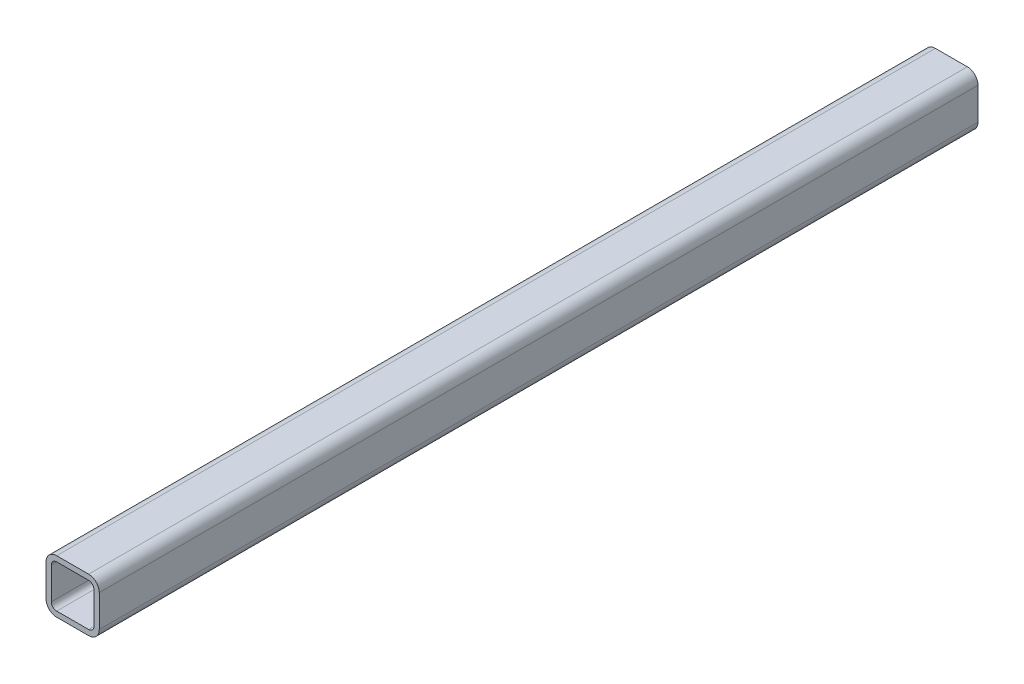
ISO-10303-21;
HEADER;
FILE_DESCRIPTION(('STEP AP214'),'2;1');
FILE_NAME('part.step','',(''),(''),'','','');
FILE_SCHEMA(('AUTOMOTIVE_DESIGN { 1 0 10303 214 1 1 1 1 }'));
ENDSEC;
DATA;
#1=APPLICATION_CONTEXT('core data for automotive mechanical design processes');
#2=APPLICATION_PROTOCOL_DEFINITION('international standard','automotive_design',2000,#1);
#3=PRODUCT_CONTEXT('',#1,'mechanical');
#4=PRODUCT('Part','Part','',(#3));
#5=PRODUCT_RELATED_PRODUCT_CATEGORY('part','',(#4));
#6=PRODUCT_DEFINITION_FORMATION('','',#4);
#7=PRODUCT_DEFINITION_CONTEXT('part definition',#1,'design');
#8=PRODUCT_DEFINITION('design','',#6,#7);
#9=PRODUCT_DEFINITION_SHAPE('','',#8);
#10=(LENGTH_UNIT() NAMED_UNIT(*) SI_UNIT(.MILLI.,.METRE.));
#11=(NAMED_UNIT(*) PLANE_ANGLE_UNIT() SI_UNIT($,.RADIAN.));
#12=(NAMED_UNIT(*) SI_UNIT($,.STERADIAN.) SOLID_ANGLE_UNIT());
#13=UNCERTAINTY_MEASURE_WITH_UNIT(LENGTH_MEASURE(1.E-05),#10,'distance_accuracy_value','');
#14=(GEOMETRIC_REPRESENTATION_CONTEXT(3) GLOBAL_UNCERTAINTY_ASSIGNED_CONTEXT((#13)) GLOBAL_UNIT_ASSIGNED_CONTEXT((#10,
#11,#12)) REPRESENTATION_CONTEXT('',''));
#15=CARTESIAN_POINT('',(0.,0.,0.));
#16=DIRECTION('',(0.,0.,1.));
#17=DIRECTION('',(1.,0.,0.));
#18=AXIS2_PLACEMENT_3D('',#15,#16,#17);
#19=CARTESIAN_POINT('',(-140.,-6.00000000000001,1300.));
#20=DIRECTION('',(-1.,0.,0.));
#21=DIRECTION('',(0.,0.,1.));
#22=AXIS2_PLACEMENT_3D('',#19,#20,#21);
#23=PLANE('',#22);
#24=DIRECTION('',(0.,-1.,0.));
#25=VECTOR('',#24,1.);
#26=CARTESIAN_POINT('',(-140.,-6.00000000000001,1310.));
#27=LINE('',#26,#25);
#28=CARTESIAN_POINT('',(-140.,6.00000000000001,1310.));
#29=VERTEX_POINT('',#28);
#30=CARTESIAN_POINT('',(-140.,-6.00000000000001,1310.));
#31=VERTEX_POINT('',#30);
#32=EDGE_CURVE('E11',#29,#31,#27,.T.);
#33=ORIENTED_EDGE('',*,*,#32,.F.);
#34=DIRECTION('',(0.,0.,1.));
#35=VECTOR('',#34,1.);
#36=CARTESIAN_POINT('',(-140.,6.00000000000001,1300.));
#37=LINE('',#36,#35);
#38=CARTESIAN_POINT('',(-140.,6.00000000000001,1640.));
#39=VERTEX_POINT('',#38);
#40=EDGE_CURVE('E178',#29,#39,#37,.T.);
#41=ORIENTED_EDGE('',*,*,#40,.T.);
#42=DIRECTION('',(0.,1.,0.));
#43=VECTOR('',#42,1.);
#44=CARTESIAN_POINT('',(-140.,-6.00000000000001,1640.));
#45=LINE('',#44,#43);
#46=CARTESIAN_POINT('',(-140.,-6.00000000000001,1640.));
#47=VERTEX_POINT('',#46);
#48=EDGE_CURVE('E49',#47,#39,#45,.T.);
#49=ORIENTED_EDGE('',*,*,#48,.F.);
#50=DIRECTION('',(0.,0.,1.));
#51=VECTOR('',#50,1.);
#52=CARTESIAN_POINT('',(-140.,-6.00000000000001,1300.));
#53=LINE('',#52,#51);
#54=EDGE_CURVE('E182',#31,#47,#53,.T.);
#55=ORIENTED_EDGE('',*,*,#54,.F.);
#56=EDGE_LOOP('',(#33,#41,#49,#55));
#57=FACE_BOUND('',#56,.T.);
#58=ADVANCED_FACE('F41',(#57),#23,.F.);
#59=CARTESIAN_POINT('',(-144.,6.00000000000001,1300.));
#60=DIRECTION('',(0.,0.,1.));
#61=DIRECTION('',(1.,0.,0.));
#62=AXIS2_PLACEMENT_3D('',#59,#60,#61);
#63=CYLINDRICAL_SURFACE('',#62,4.);
#64=CARTESIAN_POINT('',(-144.,6.00000000000001,1310.));
#65=DIRECTION('',(0.,0.,-1.));
#66=DIRECTION('',(-1.,0.,0.));
#67=AXIS2_PLACEMENT_3D('',#64,#65,#66);
#68=CIRCLE('',#67,4.);
#69=CARTESIAN_POINT('',(-144.,10.,1310.));
#70=VERTEX_POINT('',#69);
#71=EDGE_CURVE('E177',#70,#29,#68,.T.);
#72=ORIENTED_EDGE('',*,*,#71,.F.);
#73=DIRECTION('',(0.,0.,1.));
#74=VECTOR('',#73,1.);
#75=CARTESIAN_POINT('',(-144.,10.,1300.));
#76=LINE('',#75,#74);
#77=CARTESIAN_POINT('',(-144.,10.,1640.));
#78=VERTEX_POINT('',#77);
#79=EDGE_CURVE('E170',#70,#78,#76,.T.);
#80=ORIENTED_EDGE('',*,*,#79,.T.);
#81=CARTESIAN_POINT('',(-144.,6.00000000000001,1640.));
#82=DIRECTION('',(0.,0.,1.));
#83=DIRECTION('',(1.,0.,0.));
#84=AXIS2_PLACEMENT_3D('',#81,#82,#83);
#85=CIRCLE('',#84,4.);
#86=EDGE_CURVE('E152',#39,#78,#85,.T.);
#87=ORIENTED_EDGE('',*,*,#86,.F.);
#88=ORIENTED_EDGE('',*,*,#40,.F.);
#89=EDGE_LOOP('',(#72,#80,#87,#88));
#90=FACE_BOUND('',#89,.T.);
#91=ADVANCED_FACE('F176',(#90),#63,.T.);
#92=CARTESIAN_POINT('',(-156.,10.,1300.));
#93=DIRECTION('',(0.,-1.,0.));
#94=DIRECTION('',(0.,0.,-1.));
#95=AXIS2_PLACEMENT_3D('',#92,#93,#94);
#96=PLANE('',#95);
#97=DIRECTION('',(1.,0.,0.));
#98=VECTOR('',#97,1.);
#99=CARTESIAN_POINT('',(-150.,10.,1310.));
#100=LINE('',#99,#98);
#101=CARTESIAN_POINT('',(-156.,10.,1310.));
#102=VERTEX_POINT('',#101);
#103=EDGE_CURVE('E287',#102,#70,#100,.T.);
#104=ORIENTED_EDGE('',*,*,#103,.F.);
#105=DIRECTION('',(0.,0.,1.));
#106=VECTOR('',#105,1.);
#107=CARTESIAN_POINT('',(-156.,10.,1300.));
#108=LINE('',#107,#106);
#109=CARTESIAN_POINT('',(-156.,10.,1640.));
#110=VERTEX_POINT('',#109);
#111=EDGE_CURVE('E172',#102,#110,#108,.T.);
#112=ORIENTED_EDGE('',*,*,#111,.T.);
#113=DIRECTION('',(-1.,0.,0.));
#114=VECTOR('',#113,1.);
#115=CARTESIAN_POINT('',(150.,10.,1640.));
#116=LINE('',#115,#114);
#117=EDGE_CURVE('E155',#78,#110,#116,.T.);
#118=ORIENTED_EDGE('',*,*,#117,.F.);
#119=ORIENTED_EDGE('',*,*,#79,.F.);
#120=EDGE_LOOP('',(#104,#112,#118,#119));
#121=FACE_BOUND('',#120,.T.);
#122=ADVANCED_FACE('F169',(#121),#96,.F.);
#123=CARTESIAN_POINT('',(-156.,6.00000000000001,1300.));
#124=DIRECTION('',(0.,0.,1.));
#125=DIRECTION('',(1.,0.,0.));
#126=AXIS2_PLACEMENT_3D('',#123,#124,#125);
#127=CYLINDRICAL_SURFACE('',#126,4.);
#128=CARTESIAN_POINT('',(-156.,6.00000000000001,1310.));
#129=DIRECTION('',(0.,0.,-1.));
#130=DIRECTION('',(-1.,0.,0.));
#131=AXIS2_PLACEMENT_3D('',#128,#129,#130);
#132=CIRCLE('',#131,4.);
#133=CARTESIAN_POINT('',(-160.,6.00000000000001,1310.));
#134=VERTEX_POINT('',#133);
#135=EDGE_CURVE('E234',#134,#102,#132,.T.);
#136=ORIENTED_EDGE('',*,*,#135,.F.);
#137=DIRECTION('',(0.,0.,1.));
#138=VECTOR('',#137,1.);
#139=CARTESIAN_POINT('',(-160.,6.00000000000001,1300.));
#140=LINE('',#139,#138);
#141=CARTESIAN_POINT('',(-160.,6.00000000000001,1640.));
#142=VERTEX_POINT('',#141);
#143=EDGE_CURVE('E180',#134,#142,#140,.T.);
#144=ORIENTED_EDGE('',*,*,#143,.T.);
#145=CARTESIAN_POINT('',(-156.,6.00000000000001,1640.));
#146=DIRECTION('',(0.,0.,1.));
#147=DIRECTION('',(1.,0.,0.));
#148=AXIS2_PLACEMENT_3D('',#145,#146,#147);
#149=CIRCLE('',#148,4.);
#150=EDGE_CURVE('E263',#110,#142,#149,.T.);
#151=ORIENTED_EDGE('',*,*,#150,.F.);
#152=ORIENTED_EDGE('',*,*,#111,.F.);
#153=EDGE_LOOP('',(#136,#144,#151,#152));
#154=FACE_BOUND('',#153,.T.);
#155=ADVANCED_FACE('F296',(#154),#127,.T.);
#156=CARTESIAN_POINT('',(-160.,6.00000000000001,1300.));
#157=DIRECTION('',(1.,0.,0.));
#158=DIRECTION('',(0.,0.,-1.));
#159=AXIS2_PLACEMENT_3D('',#156,#157,#158);
#160=PLANE('',#159);
#161=DIRECTION('',(0.,1.,0.));
#162=VECTOR('',#161,1.);
#163=CARTESIAN_POINT('',(-160.,6.00000000000001,1310.));
#164=LINE('',#163,#162);
#165=CARTESIAN_POINT('',(-160.,-6.00000000000001,1310.));
#166=VERTEX_POINT('',#165);
#167=EDGE_CURVE('E232',#166,#134,#164,.T.);
#168=ORIENTED_EDGE('',*,*,#167,.F.);
#169=DIRECTION('',(0.,0.,1.));
#170=VECTOR('',#169,1.);
#171=CARTESIAN_POINT('',(-160.,-6.00000000000001,1300.));
#172=LINE('',#171,#170);
#173=CARTESIAN_POINT('',(-160.,-6.00000000000001,1640.));
#174=VERTEX_POINT('',#173);
#175=EDGE_CURVE('E188',#166,#174,#172,.T.);
#176=ORIENTED_EDGE('',*,*,#175,.T.);
#177=DIRECTION('',(0.,-1.,0.));
#178=VECTOR('',#177,1.);
#179=CARTESIAN_POINT('',(-160.,6.00000000000001,1640.));
#180=LINE('',#179,#178);
#181=EDGE_CURVE('E261',#142,#174,#180,.T.);
#182=ORIENTED_EDGE('',*,*,#181,.F.);
#183=ORIENTED_EDGE('',*,*,#143,.F.);
#184=EDGE_LOOP('',(#168,#176,#182,#183));
#185=FACE_BOUND('',#184,.T.);
#186=ADVANCED_FACE('F302',(#185),#160,.F.);
#187=CARTESIAN_POINT('',(-156.,-6.00000000000001,1300.));
#188=DIRECTION('',(0.,0.,1.));
#189=DIRECTION('',(1.,0.,0.));
#190=AXIS2_PLACEMENT_3D('',#187,#188,#189);
#191=CYLINDRICAL_SURFACE('',#190,4.);
#192=CARTESIAN_POINT('',(-156.,-6.00000000000001,1310.));
#193=DIRECTION('',(0.,0.,-1.));
#194=DIRECTION('',(-1.,0.,0.));
#195=AXIS2_PLACEMENT_3D('',#192,#193,#194);
#196=CIRCLE('',#195,4.);
#197=CARTESIAN_POINT('',(-156.,-10.,1310.));
#198=VERTEX_POINT('',#197);
#199=EDGE_CURVE('E201',#198,#166,#196,.T.);
#200=ORIENTED_EDGE('',*,*,#199,.F.);
#201=DIRECTION('',(0.,0.,1.));
#202=VECTOR('',#201,1.);
#203=CARTESIAN_POINT('',(-156.,-10.,1300.));
#204=LINE('',#203,#202);
#205=CARTESIAN_POINT('',(-156.,-10.,1640.));
#206=VERTEX_POINT('',#205);
#207=EDGE_CURVE('E191',#198,#206,#204,.T.);
#208=ORIENTED_EDGE('',*,*,#207,.T.);
#209=CARTESIAN_POINT('',(-156.,-6.00000000000001,1640.));
#210=DIRECTION('',(0.,0.,1.));
#211=DIRECTION('',(1.,0.,0.));
#212=AXIS2_PLACEMENT_3D('',#209,#210,#211);
#213=CIRCLE('',#212,4.);
#214=EDGE_CURVE('E259',#174,#206,#213,.T.);
#215=ORIENTED_EDGE('',*,*,#214,.F.);
#216=ORIENTED_EDGE('',*,*,#175,.F.);
#217=EDGE_LOOP('',(#200,#208,#215,#216));
#218=FACE_BOUND('',#217,.T.);
#219=ADVANCED_FACE('F306',(#218),#191,.T.);
#220=CARTESIAN_POINT('',(-144.,-10.,1300.));
#221=DIRECTION('',(0.,1.,0.));
#222=DIRECTION('',(0.,0.,1.));
#223=AXIS2_PLACEMENT_3D('',#220,#221,#222);
#224=PLANE('',#223);
#225=DIRECTION('',(1.,0.,0.));
#226=VECTOR('',#225,1.);
#227=CARTESIAN_POINT('',(-150.,-10.,1310.));
#228=LINE('',#227,#226);
#229=CARTESIAN_POINT('',(-144.,-10.,1310.));
#230=VERTEX_POINT('',#229);
#231=EDGE_CURVE('E163',#198,#230,#228,.T.);
#232=ORIENTED_EDGE('',*,*,#231,.T.);
#233=DIRECTION('',(0.,0.,1.));
#234=VECTOR('',#233,1.);
#235=CARTESIAN_POINT('',(-144.,-10.,1300.));
#236=LINE('',#235,#234);
#237=CARTESIAN_POINT('',(-144.,-10.,1640.));
#238=VERTEX_POINT('',#237);
#239=EDGE_CURVE('E194',#230,#238,#236,.T.);
#240=ORIENTED_EDGE('',*,*,#239,.T.);
#241=DIRECTION('',(-1.,0.,0.));
#242=VECTOR('',#241,1.);
#243=CARTESIAN_POINT('',(150.,-10.,1640.));
#244=LINE('',#243,#242);
#245=EDGE_CURVE('E173',#238,#206,#244,.T.);
#246=ORIENTED_EDGE('',*,*,#245,.T.);
#247=ORIENTED_EDGE('',*,*,#207,.F.);
#248=EDGE_LOOP('',(#232,#240,#246,#247));
#249=FACE_BOUND('',#248,.T.);
#250=ADVANCED_FACE('F309',(#249),#224,.F.);
#251=CARTESIAN_POINT('',(-144.,-6.00000000000001,1300.));
#252=DIRECTION('',(0.,0.,1.));
#253=DIRECTION('',(1.,0.,0.));
#254=AXIS2_PLACEMENT_3D('',#251,#252,#253);
#255=CYLINDRICAL_SURFACE('',#254,4.);
#256=CARTESIAN_POINT('',(-144.,-6.00000000000001,1310.));
#257=DIRECTION('',(0.,0.,-1.));
#258=DIRECTION('',(-1.,0.,0.));
#259=AXIS2_PLACEMENT_3D('',#256,#257,#258);
#260=CIRCLE('',#259,4.);
#261=EDGE_CURVE('E256',#31,#230,#260,.T.);
#262=ORIENTED_EDGE('',*,*,#261,.F.);
#263=ORIENTED_EDGE('',*,*,#54,.T.);
#264=CARTESIAN_POINT('',(-144.,-6.00000000000001,1640.));
#265=DIRECTION('',(0.,0.,1.));
#266=DIRECTION('',(1.,0.,0.));
#267=AXIS2_PLACEMENT_3D('',#264,#265,#266);
#268=CIRCLE('',#267,4.);
#269=EDGE_CURVE('E162',#238,#47,#268,.T.);
#270=ORIENTED_EDGE('',*,*,#269,.F.);
#271=ORIENTED_EDGE('',*,*,#239,.F.);
#272=EDGE_LOOP('',(#262,#263,#270,#271));
#273=FACE_BOUND('',#272,.T.);
#274=ADVANCED_FACE('F311',(#273),#255,.T.);
#275=CARTESIAN_POINT('',(150.,6.,1640.));
#276=DIRECTION('',(0.,0.,1.));
#277=DIRECTION('',(1.,0.,0.));
#278=AXIS2_PLACEMENT_3D('',#275,#276,#277);
#279=PLANE('',#278);
#280=DIRECTION('',(0.,-1.,0.));
#281=VECTOR('',#280,1.);
#282=CARTESIAN_POINT('',(-158.,6.00000000000001,1640.));
#283=LINE('',#282,#281);
#284=CARTESIAN_POINT('',(-158.,6.00000000000001,1640.));
#285=VERTEX_POINT('',#284);
#286=CARTESIAN_POINT('',(-158.,-6.00000000000001,1640.));
#287=VERTEX_POINT('',#286);
#288=EDGE_CURVE('E283',#285,#287,#283,.T.);
#289=ORIENTED_EDGE('',*,*,#288,.F.);
#290=CARTESIAN_POINT('',(-156.,6.00000000000001,1640.));
#291=DIRECTION('',(0.,0.,1.));
#292=DIRECTION('',(1.,0.,0.));
#293=AXIS2_PLACEMENT_3D('',#290,#291,#292);
#294=CIRCLE('',#293,2.);
#295=CARTESIAN_POINT('',(-156.,8.00000000000001,1640.));
#296=VERTEX_POINT('',#295);
#297=EDGE_CURVE('E280',#296,#285,#294,.T.);
#298=ORIENTED_EDGE('',*,*,#297,.F.);
#299=DIRECTION('',(-1.,0.,0.));
#300=VECTOR('',#299,1.);
#301=CARTESIAN_POINT('',(-156.,8.00000000000001,1640.));
#302=LINE('',#301,#300);
#303=CARTESIAN_POINT('',(-144.,8.00000000000001,1640.));
#304=VERTEX_POINT('',#303);
#305=EDGE_CURVE('E277',#304,#296,#302,.T.);
#306=ORIENTED_EDGE('',*,*,#305,.F.);
#307=CARTESIAN_POINT('',(-144.,6.00000000000001,1640.));
#308=DIRECTION('',(0.,0.,1.));
#309=DIRECTION('',(1.,0.,0.));
#310=AXIS2_PLACEMENT_3D('',#307,#308,#309);
#311=CIRCLE('',#310,2.);
#312=CARTESIAN_POINT('',(-142.,6.00000000000001,1640.));
#313=VERTEX_POINT('',#312);
#314=EDGE_CURVE('E274',#313,#304,#311,.T.);
#315=ORIENTED_EDGE('',*,*,#314,.F.);
#316=DIRECTION('',(0.,1.,0.));
#317=VECTOR('',#316,1.);
#318=CARTESIAN_POINT('',(-142.,-6.00000000000001,1640.));
#319=LINE('',#318,#317);
#320=CARTESIAN_POINT('',(-142.,-6.00000000000001,1640.));
#321=VERTEX_POINT('',#320);
#322=EDGE_CURVE('E271',#321,#313,#319,.T.);
#323=ORIENTED_EDGE('',*,*,#322,.F.);
#324=CARTESIAN_POINT('',(-144.,-6.00000000000001,1640.));
#325=DIRECTION('',(0.,0.,1.));
#326=DIRECTION('',(1.,0.,0.));
#327=AXIS2_PLACEMENT_3D('',#324,#325,#326);
#328=CIRCLE('',#327,2.);
#329=CARTESIAN_POINT('',(-144.,-8.00000000000001,1640.));
#330=VERTEX_POINT('',#329);
#331=EDGE_CURVE('E268',#330,#321,#328,.T.);
#332=ORIENTED_EDGE('',*,*,#331,.F.);
#333=DIRECTION('',(1.,0.,0.));
#334=VECTOR('',#333,1.);
#335=CARTESIAN_POINT('',(-144.,-8.00000000000001,1640.));
#336=LINE('',#335,#334);
#337=CARTESIAN_POINT('',(-156.,-8.00000000000001,1640.));
#338=VERTEX_POINT('',#337);
#339=EDGE_CURVE('E266',#338,#330,#336,.T.);
#340=ORIENTED_EDGE('',*,*,#339,.F.);
#341=CARTESIAN_POINT('',(-156.,-6.00000000000001,1640.));
#342=DIRECTION('',(0.,0.,1.));
#343=DIRECTION('',(1.,0.,0.));
#344=AXIS2_PLACEMENT_3D('',#341,#342,#343);
#345=CIRCLE('',#344,2.);
#346=EDGE_CURVE('E64',#287,#338,#345,.T.);
#347=ORIENTED_EDGE('',*,*,#346,.F.);
#348=EDGE_LOOP('',(#289,#298,#306,#315,#323,#332,#340,#347));
#349=FACE_BOUND('',#348,.T.);
#350=ORIENTED_EDGE('',*,*,#214,.T.);
#351=ORIENTED_EDGE('',*,*,#245,.F.);
#352=ORIENTED_EDGE('',*,*,#269,.T.);
#353=ORIENTED_EDGE('',*,*,#48,.T.);
#354=ORIENTED_EDGE('',*,*,#86,.T.);
#355=ORIENTED_EDGE('',*,*,#117,.T.);
#356=ORIENTED_EDGE('',*,*,#150,.T.);
#357=ORIENTED_EDGE('',*,*,#181,.T.);
#358=EDGE_LOOP('',(#350,#351,#352,#353,#354,#355,#356,#357));
#359=FACE_BOUND('',#358,.T.);
#360=ADVANCED_FACE('F154',(#349,#359),#279,.T.);
#361=CARTESIAN_POINT('',(-150.,6.,1310.));
#362=DIRECTION('',(0.,0.,-1.));
#363=DIRECTION('',(-1.,0.,0.));
#364=AXIS2_PLACEMENT_3D('',#361,#362,#363);
#365=PLANE('',#364);
#366=DIRECTION('',(-1.,0.,0.));
#367=VECTOR('',#366,1.);
#368=CARTESIAN_POINT('',(-144.,-8.00000000000001,1310.));
#369=LINE('',#368,#367);
#370=CARTESIAN_POINT('',(-144.,-8.00000000000001,1310.));
#371=VERTEX_POINT('',#370);
#372=CARTESIAN_POINT('',(-156.,-8.00000000000001,1310.));
#373=VERTEX_POINT('',#372);
#374=EDGE_CURVE('E239',#371,#373,#369,.T.);
#375=ORIENTED_EDGE('',*,*,#374,.F.);
#376=CARTESIAN_POINT('',(-144.,-6.00000000000001,1310.));
#377=DIRECTION('',(0.,0.,-1.));
#378=DIRECTION('',(-1.,0.,0.));
#379=AXIS2_PLACEMENT_3D('',#376,#377,#378);
#380=CIRCLE('',#379,2.);
#381=CARTESIAN_POINT('',(-142.,-6.00000000000001,1310.));
#382=VERTEX_POINT('',#381);
#383=EDGE_CURVE('E241',#382,#371,#380,.T.);
#384=ORIENTED_EDGE('',*,*,#383,.F.);
#385=DIRECTION('',(0.,-1.,0.));
#386=VECTOR('',#385,1.);
#387=CARTESIAN_POINT('',(-142.,-6.00000000000001,1310.));
#388=LINE('',#387,#386);
#389=CARTESIAN_POINT('',(-142.,6.00000000000001,1310.));
#390=VERTEX_POINT('',#389);
#391=EDGE_CURVE('E244',#390,#382,#388,.T.);
#392=ORIENTED_EDGE('',*,*,#391,.F.);
#393=CARTESIAN_POINT('',(-144.,6.00000000000001,1310.));
#394=DIRECTION('',(0.,0.,-1.));
#395=DIRECTION('',(-1.,0.,0.));
#396=AXIS2_PLACEMENT_3D('',#393,#394,#395);
#397=CIRCLE('',#396,2.);
#398=CARTESIAN_POINT('',(-144.,8.00000000000001,1310.));
#399=VERTEX_POINT('',#398);
#400=EDGE_CURVE('E247',#399,#390,#397,.T.);
#401=ORIENTED_EDGE('',*,*,#400,.F.);
#402=DIRECTION('',(1.,0.,0.));
#403=VECTOR('',#402,1.);
#404=CARTESIAN_POINT('',(-156.,8.00000000000001,1310.));
#405=LINE('',#404,#403);
#406=CARTESIAN_POINT('',(-156.,8.00000000000001,1310.));
#407=VERTEX_POINT('',#406);
#408=EDGE_CURVE('E250',#407,#399,#405,.T.);
#409=ORIENTED_EDGE('',*,*,#408,.F.);
#410=CARTESIAN_POINT('',(-156.,6.00000000000001,1310.));
#411=DIRECTION('',(0.,0.,-1.));
#412=DIRECTION('',(-1.,0.,0.));
#413=AXIS2_PLACEMENT_3D('',#410,#411,#412);
#414=CIRCLE('',#413,2.);
#415=CARTESIAN_POINT('',(-158.,6.00000000000001,1310.));
#416=VERTEX_POINT('',#415);
#417=EDGE_CURVE('E56',#416,#407,#414,.T.);
#418=ORIENTED_EDGE('',*,*,#417,.F.);
#419=DIRECTION('',(0.,1.,0.));
#420=VECTOR('',#419,1.);
#421=CARTESIAN_POINT('',(-158.,6.00000000000001,1310.));
#422=LINE('',#421,#420);
#423=CARTESIAN_POINT('',(-158.,-6.00000000000001,1310.));
#424=VERTEX_POINT('',#423);
#425=EDGE_CURVE('E254',#424,#416,#422,.T.);
#426=ORIENTED_EDGE('',*,*,#425,.F.);
#427=CARTESIAN_POINT('',(-156.,-6.00000000000001,1310.));
#428=DIRECTION('',(0.,0.,-1.));
#429=DIRECTION('',(-1.,0.,0.));
#430=AXIS2_PLACEMENT_3D('',#427,#428,#429);
#431=CIRCLE('',#430,2.);
#432=EDGE_CURVE('E236',#373,#424,#431,.T.);
#433=ORIENTED_EDGE('',*,*,#432,.F.);
#434=EDGE_LOOP('',(#375,#384,#392,#401,#409,#418,#426,#433));
#435=FACE_BOUND('',#434,.T.);
#436=ORIENTED_EDGE('',*,*,#199,.T.);
#437=ORIENTED_EDGE('',*,*,#167,.T.);
#438=ORIENTED_EDGE('',*,*,#135,.T.);
#439=ORIENTED_EDGE('',*,*,#103,.T.);
#440=ORIENTED_EDGE('',*,*,#71,.T.);
#441=ORIENTED_EDGE('',*,*,#32,.T.);
#442=ORIENTED_EDGE('',*,*,#261,.T.);
#443=ORIENTED_EDGE('',*,*,#231,.F.);
#444=EDGE_LOOP('',(#436,#437,#438,#439,#440,#441,#442,#443));
#445=FACE_BOUND('',#444,.T.);
#446=ADVANCED_FACE('F292',(#435,#445),#365,.T.);
#447=CARTESIAN_POINT('',(-156.,-6.00000000000001,1300.));
#448=DIRECTION('',(0.,0.,1.));
#449=DIRECTION('',(1.,0.,0.));
#450=AXIS2_PLACEMENT_3D('',#447,#448,#449);
#451=CYLINDRICAL_SURFACE('',#450,2.);
#452=DIRECTION('',(0.,0.,1.));
#453=VECTOR('',#452,1.);
#454=CARTESIAN_POINT('',(-156.,-8.00000000000001,1300.));
#455=LINE('',#454,#453);
#456=EDGE_CURVE('E219',#373,#338,#455,.T.);
#457=ORIENTED_EDGE('',*,*,#456,.F.);
#458=ORIENTED_EDGE('',*,*,#432,.T.);
#459=DIRECTION('',(0.,0.,1.));
#460=VECTOR('',#459,1.);
#461=CARTESIAN_POINT('',(-158.,-6.00000000000001,1300.));
#462=LINE('',#461,#460);
#463=EDGE_CURVE('E197',#424,#287,#462,.T.);
#464=ORIENTED_EDGE('',*,*,#463,.T.);
#465=ORIENTED_EDGE('',*,*,#346,.T.);
#466=EDGE_LOOP('',(#457,#458,#464,#465));
#467=FACE_BOUND('',#466,.T.);
#468=ADVANCED_FACE('F43',(#467),#451,.F.);
#469=CARTESIAN_POINT('',(-144.,-8.00000000000001,1300.));
#470=DIRECTION('',(0.,1.,0.));
#471=DIRECTION('',(0.,0.,1.));
#472=AXIS2_PLACEMENT_3D('',#469,#470,#471);
#473=PLANE('',#472);
#474=DIRECTION('',(0.,0.,1.));
#475=VECTOR('',#474,1.);
#476=CARTESIAN_POINT('',(-144.,-8.00000000000001,1300.));
#477=LINE('',#476,#475);
#478=EDGE_CURVE('E216',#371,#330,#477,.T.);
#479=ORIENTED_EDGE('',*,*,#478,.F.);
#480=ORIENTED_EDGE('',*,*,#374,.T.);
#481=ORIENTED_EDGE('',*,*,#456,.T.);
#482=ORIENTED_EDGE('',*,*,#339,.T.);
#483=EDGE_LOOP('',(#479,#480,#481,#482));
#484=FACE_BOUND('',#483,.T.);
#485=ADVANCED_FACE('F357',(#484),#473,.T.);
#486=CARTESIAN_POINT('',(-144.,-6.00000000000001,1300.));
#487=DIRECTION('',(0.,0.,1.));
#488=DIRECTION('',(1.,0.,0.));
#489=AXIS2_PLACEMENT_3D('',#486,#487,#488);
#490=CYLINDRICAL_SURFACE('',#489,2.);
#491=DIRECTION('',(0.,0.,1.));
#492=VECTOR('',#491,1.);
#493=CARTESIAN_POINT('',(-142.,-6.00000000000001,1300.));
#494=LINE('',#493,#492);
#495=EDGE_CURVE('E213',#382,#321,#494,.T.);
#496=ORIENTED_EDGE('',*,*,#495,.F.);
#497=ORIENTED_EDGE('',*,*,#383,.T.);
#498=ORIENTED_EDGE('',*,*,#478,.T.);
#499=ORIENTED_EDGE('',*,*,#331,.T.);
#500=EDGE_LOOP('',(#496,#497,#498,#499));
#501=FACE_BOUND('',#500,.T.);
#502=ADVANCED_FACE('F354',(#501),#490,.F.);
#503=CARTESIAN_POINT('',(-142.,-6.00000000000001,1300.));
#504=DIRECTION('',(-1.,0.,0.));
#505=DIRECTION('',(0.,0.,1.));
#506=AXIS2_PLACEMENT_3D('',#503,#504,#505);
#507=PLANE('',#506);
#508=DIRECTION('',(0.,0.,1.));
#509=VECTOR('',#508,1.);
#510=CARTESIAN_POINT('',(-142.,6.00000000000001,1300.));
#511=LINE('',#510,#509);
#512=EDGE_CURVE('E210',#390,#313,#511,.T.);
#513=ORIENTED_EDGE('',*,*,#512,.F.);
#514=ORIENTED_EDGE('',*,*,#391,.T.);
#515=ORIENTED_EDGE('',*,*,#495,.T.);
#516=ORIENTED_EDGE('',*,*,#322,.T.);
#517=EDGE_LOOP('',(#513,#514,#515,#516));
#518=FACE_BOUND('',#517,.T.);
#519=ADVANCED_FACE('F350',(#518),#507,.T.);
#520=CARTESIAN_POINT('',(-144.,6.00000000000001,1300.));
#521=DIRECTION('',(0.,0.,1.));
#522=DIRECTION('',(1.,0.,0.));
#523=AXIS2_PLACEMENT_3D('',#520,#521,#522);
#524=CYLINDRICAL_SURFACE('',#523,2.);
#525=DIRECTION('',(0.,0.,1.));
#526=VECTOR('',#525,1.);
#527=CARTESIAN_POINT('',(-144.,8.00000000000001,1300.));
#528=LINE('',#527,#526);
#529=EDGE_CURVE('E207',#399,#304,#528,.T.);
#530=ORIENTED_EDGE('',*,*,#529,.F.);
#531=ORIENTED_EDGE('',*,*,#400,.T.);
#532=ORIENTED_EDGE('',*,*,#512,.T.);
#533=ORIENTED_EDGE('',*,*,#314,.T.);
#534=EDGE_LOOP('',(#530,#531,#532,#533));
#535=FACE_BOUND('',#534,.T.);
#536=ADVANCED_FACE('F346',(#535),#524,.F.);
#537=CARTESIAN_POINT('',(-156.,8.00000000000001,1300.));
#538=DIRECTION('',(0.,-1.,0.));
#539=DIRECTION('',(0.,0.,-1.));
#540=AXIS2_PLACEMENT_3D('',#537,#538,#539);
#541=PLANE('',#540);
#542=DIRECTION('',(0.,0.,1.));
#543=VECTOR('',#542,1.);
#544=CARTESIAN_POINT('',(-156.,8.00000000000001,1300.));
#545=LINE('',#544,#543);
#546=EDGE_CURVE('E204',#407,#296,#545,.T.);
#547=ORIENTED_EDGE('',*,*,#546,.F.);
#548=ORIENTED_EDGE('',*,*,#408,.T.);
#549=ORIENTED_EDGE('',*,*,#529,.T.);
#550=ORIENTED_EDGE('',*,*,#305,.T.);
#551=EDGE_LOOP('',(#547,#548,#549,#550));
#552=FACE_BOUND('',#551,.T.);
#553=ADVANCED_FACE('F342',(#552),#541,.T.);
#554=CARTESIAN_POINT('',(-156.,6.00000000000001,1300.));
#555=DIRECTION('',(0.,0.,1.));
#556=DIRECTION('',(1.,0.,0.));
#557=AXIS2_PLACEMENT_3D('',#554,#555,#556);
#558=CYLINDRICAL_SURFACE('',#557,2.);
#559=DIRECTION('',(0.,0.,1.));
#560=VECTOR('',#559,1.);
#561=CARTESIAN_POINT('',(-158.,6.00000000000001,1300.));
#562=LINE('',#561,#560);
#563=EDGE_CURVE('E200',#416,#285,#562,.T.);
#564=ORIENTED_EDGE('',*,*,#563,.F.);
#565=ORIENTED_EDGE('',*,*,#417,.T.);
#566=ORIENTED_EDGE('',*,*,#546,.T.);
#567=ORIENTED_EDGE('',*,*,#297,.T.);
#568=EDGE_LOOP('',(#564,#565,#566,#567));
#569=FACE_BOUND('',#568,.T.);
#570=ADVANCED_FACE('F338',(#569),#558,.F.);
#571=CARTESIAN_POINT('',(-158.,6.00000000000001,1300.));
#572=DIRECTION('',(1.,0.,0.));
#573=DIRECTION('',(0.,0.,-1.));
#574=AXIS2_PLACEMENT_3D('',#571,#572,#573);
#575=PLANE('',#574);
#576=ORIENTED_EDGE('',*,*,#463,.F.);
#577=ORIENTED_EDGE('',*,*,#425,.T.);
#578=ORIENTED_EDGE('',*,*,#563,.T.);
#579=ORIENTED_EDGE('',*,*,#288,.T.);
#580=EDGE_LOOP('',(#576,#577,#578,#579));
#581=FACE_BOUND('',#580,.T.);
#582=ADVANCED_FACE('F335',(#581),#575,.T.);
#583=CLOSED_SHELL('',(#58,#91,#122,#155,#186,#219,#250,#274,#360,#446,#468,#485,#502,#519,#536,
#553,#570,#582));
#584=MANIFOLD_SOLID_BREP('B2',#583);
#585=ADVANCED_BREP_SHAPE_REPRESENTATION('',(#18,#584),#14);
#586=SHAPE_DEFINITION_REPRESENTATION(#9,#585);
ENDSEC;
END-ISO-10303-21;
